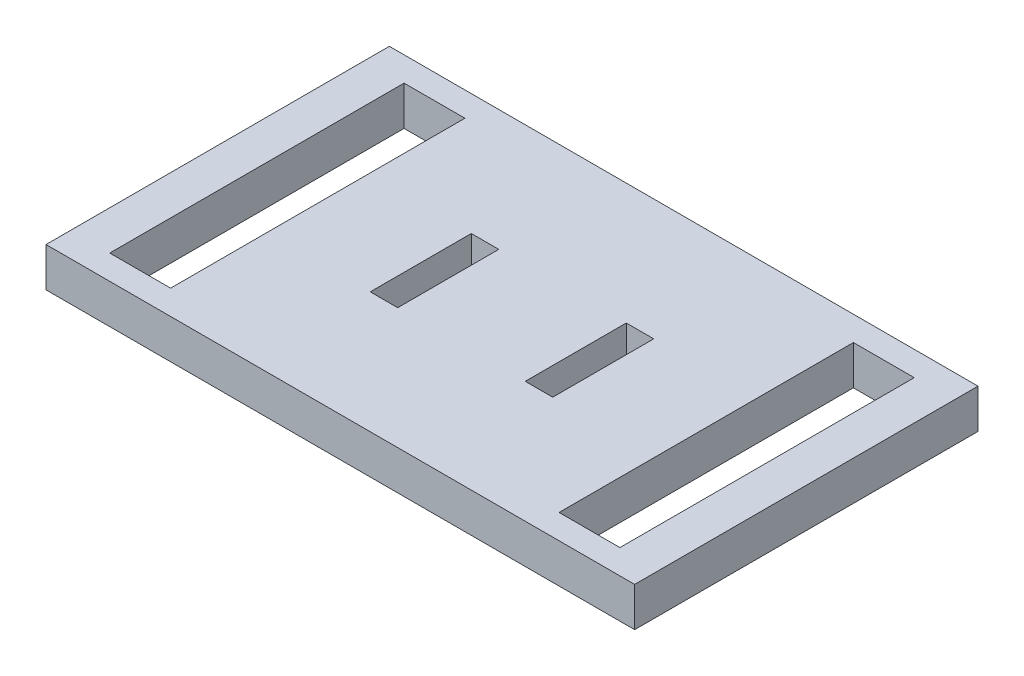
ISO-10303-21;
HEADER;
FILE_DESCRIPTION(('STEP AP214'),'2;1');
FILE_NAME('part.step','',(''),(''),'','','');
FILE_SCHEMA(('AUTOMOTIVE_DESIGN { 1 0 10303 214 1 1 1 1 }'));
ENDSEC;
DATA;
#1=APPLICATION_CONTEXT('core data for automotive mechanical design processes');
#2=APPLICATION_PROTOCOL_DEFINITION('international standard','automotive_design',2000,#1);
#3=PRODUCT_CONTEXT('',#1,'mechanical');
#4=PRODUCT('Part','Part','',(#3));
#5=PRODUCT_RELATED_PRODUCT_CATEGORY('part','',(#4));
#6=PRODUCT_DEFINITION_FORMATION('','',#4);
#7=PRODUCT_DEFINITION_CONTEXT('part definition',#1,'design');
#8=PRODUCT_DEFINITION('design','',#6,#7);
#9=PRODUCT_DEFINITION_SHAPE('','',#8);
#10=(LENGTH_UNIT() NAMED_UNIT(*) SI_UNIT(.MILLI.,.METRE.));
#11=(NAMED_UNIT(*) PLANE_ANGLE_UNIT() SI_UNIT($,.RADIAN.));
#12=(NAMED_UNIT(*) SI_UNIT($,.STERADIAN.) SOLID_ANGLE_UNIT());
#13=UNCERTAINTY_MEASURE_WITH_UNIT(LENGTH_MEASURE(1.E-05),#10,'distance_accuracy_value','');
#14=(GEOMETRIC_REPRESENTATION_CONTEXT(3) GLOBAL_UNCERTAINTY_ASSIGNED_CONTEXT((#13)) GLOBAL_UNIT_ASSIGNED_CONTEXT((#10,
#11,#12)) REPRESENTATION_CONTEXT('',''));
#15=CARTESIAN_POINT('',(0.,0.,0.));
#16=DIRECTION('',(0.,0.,1.));
#17=DIRECTION('',(1.,0.,0.));
#18=AXIS2_PLACEMENT_3D('',#15,#16,#17);
#19=CARTESIAN_POINT('',(0.,4.,0.));
#20=DIRECTION('',(0.,1.,0.));
#21=DIRECTION('',(0.,0.,1.));
#22=AXIS2_PLACEMENT_3D('',#19,#20,#21);
#23=PLANE('',#22);
#24=DIRECTION('',(0.,0.,1.));
#25=VECTOR('',#24,1.);
#26=CARTESIAN_POINT('',(-19.5406896540598,4.,-6.75221749933354));
#27=LINE('',#26,#25);
#28=CARTESIAN_POINT('',(-19.5406896540598,4.,-6.75221749933354));
#29=VERTEX_POINT('',#28);
#30=CARTESIAN_POINT('',(-19.5406896540598,4.,28.2477825006665));
#31=VERTEX_POINT('',#30);
#32=EDGE_CURVE('E298',#29,#31,#27,.T.);
#33=ORIENTED_EDGE('',*,*,#32,.T.);
#34=DIRECTION('',(1.,0.,0.));
#35=VECTOR('',#34,1.);
#36=CARTESIAN_POINT('',(-19.5406896540598,4.,28.2477825006665));
#37=LINE('',#36,#35);
#38=CARTESIAN_POINT('',(40.4593103459402,4.,28.2477825006665));
#39=VERTEX_POINT('',#38);
#40=EDGE_CURVE('E301',#31,#39,#37,.T.);
#41=ORIENTED_EDGE('',*,*,#40,.T.);
#42=DIRECTION('',(0.,0.,-1.));
#43=VECTOR('',#42,1.);
#44=CARTESIAN_POINT('',(40.4593103459402,4.,-6.75221749933354));
#45=LINE('',#44,#43);
#46=CARTESIAN_POINT('',(40.4593103459402,4.,-6.75221749933354));
#47=VERTEX_POINT('',#46);
#48=EDGE_CURVE('E304',#39,#47,#45,.T.);
#49=ORIENTED_EDGE('',*,*,#48,.T.);
#50=DIRECTION('',(-1.,0.,0.));
#51=VECTOR('',#50,1.);
#52=CARTESIAN_POINT('',(-19.5406896540598,4.,-6.75221749933354));
#53=LINE('',#52,#51);
#54=EDGE_CURVE('E306',#47,#29,#53,.T.);
#55=ORIENTED_EDGE('',*,*,#54,.T.);
#56=EDGE_LOOP('',(#33,#41,#49,#55));
#57=FACE_BOUND('',#56,.T.);
#58=DIRECTION('',(1.,0.,0.));
#59=VECTOR('',#58,1.);
#60=CARTESIAN_POINT('',(-15.5406896540597,4.,25.7477825006665));
#61=LINE('',#60,#59);
#62=CARTESIAN_POINT('',(-15.5406896540597,4.,25.7477825006665));
#63=VERTEX_POINT('',#62);
#64=CARTESIAN_POINT('',(-9.34068965405975,4.,25.7477825006665));
#65=VERTEX_POINT('',#64);
#66=EDGE_CURVE('E269',#63,#65,#61,.T.);
#67=ORIENTED_EDGE('',*,*,#66,.F.);
#68=DIRECTION('',(0.,0.,1.));
#69=VECTOR('',#68,1.);
#70=CARTESIAN_POINT('',(-15.5406896540598,4.,-4.25221749933353));
#71=LINE('',#70,#69);
#72=CARTESIAN_POINT('',(-15.5406896540598,4.,-4.25221749933353));
#73=VERTEX_POINT('',#72);
#74=EDGE_CURVE('E267',#73,#63,#71,.T.);
#75=ORIENTED_EDGE('',*,*,#74,.F.);
#76=DIRECTION('',(-1.,0.,0.));
#77=VECTOR('',#76,1.);
#78=CARTESIAN_POINT('',(-15.5406896540598,4.,-4.25221749933353));
#79=LINE('',#78,#77);
#80=CARTESIAN_POINT('',(-9.34068965405975,4.,-4.25221749933353));
#81=VERTEX_POINT('',#80);
#82=EDGE_CURVE('E275',#81,#73,#79,.T.);
#83=ORIENTED_EDGE('',*,*,#82,.F.);
#84=DIRECTION('',(0.,0.,-1.));
#85=VECTOR('',#84,1.);
#86=CARTESIAN_POINT('',(-9.34068965405975,4.,-4.25221749933353));
#87=LINE('',#86,#85);
#88=EDGE_CURVE('E272',#65,#81,#87,.T.);
#89=ORIENTED_EDGE('',*,*,#88,.F.);
#90=EDGE_LOOP('',(#67,#75,#83,#89));
#91=FACE_BOUND('',#90,.T.);
#92=DIRECTION('',(1.,0.,0.));
#93=VECTOR('',#92,1.);
#94=CARTESIAN_POINT('',(1.15931034594025,4.,15.8977825006665));
#95=LINE('',#94,#93);
#96=CARTESIAN_POINT('',(1.15931034594025,4.,15.8977825006665));
#97=VERTEX_POINT('',#96);
#98=CARTESIAN_POINT('',(3.95931034594025,4.,15.8977825006665));
#99=VERTEX_POINT('',#98);
#100=EDGE_CURVE('E238',#97,#99,#95,.T.);
#101=ORIENTED_EDGE('',*,*,#100,.F.);
#102=DIRECTION('',(0.,0.,1.));
#103=VECTOR('',#102,1.);
#104=CARTESIAN_POINT('',(1.15931034594025,4.,5.59778250066647));
#105=LINE('',#104,#103);
#106=CARTESIAN_POINT('',(1.15931034594025,4.,5.59778250066647));
#107=VERTEX_POINT('',#106);
#108=EDGE_CURVE('E236',#107,#97,#105,.T.);
#109=ORIENTED_EDGE('',*,*,#108,.F.);
#110=DIRECTION('',(-1.,0.,0.));
#111=VECTOR('',#110,1.);
#112=CARTESIAN_POINT('',(1.15931034594025,4.,5.59778250066647));
#113=LINE('',#112,#111);
#114=CARTESIAN_POINT('',(3.95931034594025,4.,5.59778250066647));
#115=VERTEX_POINT('',#114);
#116=EDGE_CURVE('E244',#115,#107,#113,.T.);
#117=ORIENTED_EDGE('',*,*,#116,.F.);
#118=DIRECTION('',(0.,0.,-1.));
#119=VECTOR('',#118,1.);
#120=CARTESIAN_POINT('',(3.95931034594025,4.,5.59778250066647));
#121=LINE('',#120,#119);
#122=EDGE_CURVE('E241',#99,#115,#121,.T.);
#123=ORIENTED_EDGE('',*,*,#122,.F.);
#124=EDGE_LOOP('',(#101,#109,#117,#123));
#125=FACE_BOUND('',#124,.T.);
#126=DIRECTION('',(-1.,0.,0.));
#127=VECTOR('',#126,1.);
#128=CARTESIAN_POINT('',(19.7593103459402,4.,5.59778250066647));
#129=LINE('',#128,#127);
#130=CARTESIAN_POINT('',(19.7593103459402,4.,5.59778250066647));
#131=VERTEX_POINT('',#130);
#132=CARTESIAN_POINT('',(16.9593103459402,4.,5.59778250066647));
#133=VERTEX_POINT('',#132);
#134=EDGE_CURVE('E207',#131,#133,#129,.T.);
#135=ORIENTED_EDGE('',*,*,#134,.F.);
#136=DIRECTION('',(0.,0.,-1.));
#137=VECTOR('',#136,1.);
#138=CARTESIAN_POINT('',(19.7593103459402,4.,5.59778250066647));
#139=LINE('',#138,#137);
#140=CARTESIAN_POINT('',(19.7593103459402,4.,15.8977825006665));
#141=VERTEX_POINT('',#140);
#142=EDGE_CURVE('E205',#141,#131,#139,.T.);
#143=ORIENTED_EDGE('',*,*,#142,.F.);
#144=DIRECTION('',(1.,0.,0.));
#145=VECTOR('',#144,1.);
#146=CARTESIAN_POINT('',(19.7593103459402,4.,15.8977825006665));
#147=LINE('',#146,#145);
#148=CARTESIAN_POINT('',(16.9593103459402,4.,15.8977825006665));
#149=VERTEX_POINT('',#148);
#150=EDGE_CURVE('E213',#149,#141,#147,.T.);
#151=ORIENTED_EDGE('',*,*,#150,.F.);
#152=DIRECTION('',(0.,0.,1.));
#153=VECTOR('',#152,1.);
#154=CARTESIAN_POINT('',(16.9593103459402,4.,5.59778250066647));
#155=LINE('',#154,#153);
#156=EDGE_CURVE('E210',#133,#149,#155,.T.);
#157=ORIENTED_EDGE('',*,*,#156,.F.);
#158=EDGE_LOOP('',(#135,#143,#151,#157));
#159=FACE_BOUND('',#158,.T.);
#160=DIRECTION('',(-1.,0.,0.));
#161=VECTOR('',#160,1.);
#162=CARTESIAN_POINT('',(36.4593103459403,4.,-4.25221749933353));
#163=LINE('',#162,#161);
#164=CARTESIAN_POINT('',(36.4593103459403,4.,-4.25221749933353));
#165=VERTEX_POINT('',#164);
#166=CARTESIAN_POINT('',(30.2593103459402,4.,-4.25221749933353));
#167=VERTEX_POINT('',#166);
#168=EDGE_CURVE('E177',#165,#167,#163,.T.);
#169=ORIENTED_EDGE('',*,*,#168,.F.);
#170=DIRECTION('',(0.,0.,-1.));
#171=VECTOR('',#170,1.);
#172=CARTESIAN_POINT('',(36.4593103459403,4.,-4.25221749933353));
#173=LINE('',#172,#171);
#174=CARTESIAN_POINT('',(36.4593103459402,4.,25.7477825006665));
#175=VERTEX_POINT('',#174);
#176=EDGE_CURVE('E169',#175,#165,#173,.T.);
#177=ORIENTED_EDGE('',*,*,#176,.F.);
#178=DIRECTION('',(1.,0.,0.));
#179=VECTOR('',#178,1.);
#180=CARTESIAN_POINT('',(36.4593103459402,4.,25.7477825006665));
#181=LINE('',#180,#179);
#182=CARTESIAN_POINT('',(30.2593103459402,4.,25.7477825006665));
#183=VERTEX_POINT('',#182);
#184=EDGE_CURVE('E191',#183,#175,#181,.T.);
#185=ORIENTED_EDGE('',*,*,#184,.F.);
#186=DIRECTION('',(0.,0.,1.));
#187=VECTOR('',#186,1.);
#188=CARTESIAN_POINT('',(30.2593103459402,4.,-4.25221749933353));
#189=LINE('',#188,#187);
#190=EDGE_CURVE('E189',#167,#183,#189,.T.);
#191=ORIENTED_EDGE('',*,*,#190,.F.);
#192=EDGE_LOOP('',(#169,#177,#185,#191));
#193=FACE_BOUND('',#192,.T.);
#194=ADVANCED_FACE('F32',(#57,#91,#125,#159,#193),#23,.T.);
#195=CARTESIAN_POINT('',(0.,0.,0.));
#196=DIRECTION('',(0.,1.,0.));
#197=DIRECTION('',(0.,0.,1.));
#198=AXIS2_PLACEMENT_3D('',#195,#196,#197);
#199=PLANE('',#198);
#200=DIRECTION('',(0.,0.,-1.));
#201=VECTOR('',#200,1.);
#202=CARTESIAN_POINT('',(19.7593103459402,0.,5.59778250066647));
#203=LINE('',#202,#201);
#204=CARTESIAN_POINT('',(19.7593103459402,0.,15.8977825006665));
#205=VERTEX_POINT('',#204);
#206=CARTESIAN_POINT('',(19.7593103459402,0.,5.59778250066647));
#207=VERTEX_POINT('',#206);
#208=EDGE_CURVE('E185',#205,#207,#203,.T.);
#209=ORIENTED_EDGE('',*,*,#208,.T.);
#210=DIRECTION('',(-1.,0.,0.));
#211=VECTOR('',#210,1.);
#212=CARTESIAN_POINT('',(19.7593103459402,0.,5.59778250066647));
#213=LINE('',#212,#211);
#214=CARTESIAN_POINT('',(16.9593103459402,0.,5.59778250066647));
#215=VERTEX_POINT('',#214);
#216=EDGE_CURVE('E218',#207,#215,#213,.T.);
#217=ORIENTED_EDGE('',*,*,#216,.T.);
#218=DIRECTION('',(0.,0.,1.));
#219=VECTOR('',#218,1.);
#220=CARTESIAN_POINT('',(16.9593103459402,0.,5.59778250066647));
#221=LINE('',#220,#219);
#222=CARTESIAN_POINT('',(16.9593103459402,0.,15.8977825006665));
#223=VERTEX_POINT('',#222);
#224=EDGE_CURVE('E221',#215,#223,#221,.T.);
#225=ORIENTED_EDGE('',*,*,#224,.T.);
#226=DIRECTION('',(1.,0.,0.));
#227=VECTOR('',#226,1.);
#228=CARTESIAN_POINT('',(19.7593103459402,0.,15.8977825006665));
#229=LINE('',#228,#227);
#230=EDGE_CURVE('E208',#223,#205,#229,.T.);
#231=ORIENTED_EDGE('',*,*,#230,.T.);
#232=EDGE_LOOP('',(#209,#217,#225,#231));
#233=FACE_BOUND('',#232,.T.);
#234=DIRECTION('',(0.,0.,1.));
#235=VECTOR('',#234,1.);
#236=CARTESIAN_POINT('',(-15.5406896540598,0.,-4.25221749933353));
#237=LINE('',#236,#235);
#238=CARTESIAN_POINT('',(-15.5406896540598,0.,-4.25221749933353));
#239=VERTEX_POINT('',#238);
#240=CARTESIAN_POINT('',(-15.5406896540597,0.,25.7477825006665));
#241=VERTEX_POINT('',#240);
#242=EDGE_CURVE('E266',#239,#241,#237,.T.);
#243=ORIENTED_EDGE('',*,*,#242,.T.);
#244=DIRECTION('',(1.,0.,0.));
#245=VECTOR('',#244,1.);
#246=CARTESIAN_POINT('',(-15.5406896540597,0.,25.7477825006665));
#247=LINE('',#246,#245);
#248=CARTESIAN_POINT('',(-9.34068965405975,0.,25.7477825006665));
#249=VERTEX_POINT('',#248);
#250=EDGE_CURVE('E280',#241,#249,#247,.T.);
#251=ORIENTED_EDGE('',*,*,#250,.T.);
#252=DIRECTION('',(0.,0.,-1.));
#253=VECTOR('',#252,1.);
#254=CARTESIAN_POINT('',(-9.34068965405975,0.,-4.25221749933353));
#255=LINE('',#254,#253);
#256=CARTESIAN_POINT('',(-9.34068965405975,0.,-4.25221749933353));
#257=VERTEX_POINT('',#256);
#258=EDGE_CURVE('E283',#249,#257,#255,.T.);
#259=ORIENTED_EDGE('',*,*,#258,.T.);
#260=DIRECTION('',(-1.,0.,0.));
#261=VECTOR('',#260,1.);
#262=CARTESIAN_POINT('',(-15.5406896540598,0.,-4.25221749933353));
#263=LINE('',#262,#261);
#264=EDGE_CURVE('E270',#257,#239,#263,.T.);
#265=ORIENTED_EDGE('',*,*,#264,.T.);
#266=EDGE_LOOP('',(#243,#251,#259,#265));
#267=FACE_BOUND('',#266,.T.);
#268=DIRECTION('',(0.,0.,1.));
#269=VECTOR('',#268,1.);
#270=CARTESIAN_POINT('',(-19.5406896540598,0.,-6.75221749933354));
#271=LINE('',#270,#269);
#272=CARTESIAN_POINT('',(-19.5406896540598,0.,-6.75221749933354));
#273=VERTEX_POINT('',#272);
#274=CARTESIAN_POINT('',(-19.5406896540598,0.,28.2477825006665));
#275=VERTEX_POINT('',#274);
#276=EDGE_CURVE('E297',#273,#275,#271,.T.);
#277=ORIENTED_EDGE('',*,*,#276,.F.);
#278=DIRECTION('',(-1.,0.,0.));
#279=VECTOR('',#278,1.);
#280=CARTESIAN_POINT('',(-19.5406896540598,0.,-6.75221749933354));
#281=LINE('',#280,#279);
#282=CARTESIAN_POINT('',(40.4593103459402,0.,-6.75221749933354));
#283=VERTEX_POINT('',#282);
#284=EDGE_CURVE('E302',#283,#273,#281,.T.);
#285=ORIENTED_EDGE('',*,*,#284,.F.);
#286=DIRECTION('',(0.,0.,-1.));
#287=VECTOR('',#286,1.);
#288=CARTESIAN_POINT('',(40.4593103459402,0.,-6.75221749933354));
#289=LINE('',#288,#287);
#290=CARTESIAN_POINT('',(40.4593103459402,0.,28.2477825006665));
#291=VERTEX_POINT('',#290);
#292=EDGE_CURVE('E313',#291,#283,#289,.T.);
#293=ORIENTED_EDGE('',*,*,#292,.F.);
#294=DIRECTION('',(1.,0.,0.));
#295=VECTOR('',#294,1.);
#296=CARTESIAN_POINT('',(-19.5406896540598,0.,28.2477825006665));
#297=LINE('',#296,#295);
#298=EDGE_CURVE('E311',#275,#291,#297,.T.);
#299=ORIENTED_EDGE('',*,*,#298,.F.);
#300=EDGE_LOOP('',(#277,#285,#293,#299));
#301=FACE_BOUND('',#300,.T.);
#302=DIRECTION('',(0.,0.,1.));
#303=VECTOR('',#302,1.);
#304=CARTESIAN_POINT('',(1.15931034594025,0.,5.59778250066647));
#305=LINE('',#304,#303);
#306=CARTESIAN_POINT('',(1.15931034594025,0.,5.59778250066647));
#307=VERTEX_POINT('',#306);
#308=CARTESIAN_POINT('',(1.15931034594025,0.,15.8977825006665));
#309=VERTEX_POINT('',#308);
#310=EDGE_CURVE('E235',#307,#309,#305,.T.);
#311=ORIENTED_EDGE('',*,*,#310,.T.);
#312=DIRECTION('',(1.,0.,0.));
#313=VECTOR('',#312,1.);
#314=CARTESIAN_POINT('',(1.15931034594025,0.,15.8977825006665));
#315=LINE('',#314,#313);
#316=CARTESIAN_POINT('',(3.95931034594025,0.,15.8977825006665));
#317=VERTEX_POINT('',#316);
#318=EDGE_CURVE('E249',#309,#317,#315,.T.);
#319=ORIENTED_EDGE('',*,*,#318,.T.);
#320=DIRECTION('',(0.,0.,-1.));
#321=VECTOR('',#320,1.);
#322=CARTESIAN_POINT('',(3.95931034594025,0.,5.59778250066647));
#323=LINE('',#322,#321);
#324=CARTESIAN_POINT('',(3.95931034594025,0.,5.59778250066647));
#325=VERTEX_POINT('',#324);
#326=EDGE_CURVE('E252',#317,#325,#323,.T.);
#327=ORIENTED_EDGE('',*,*,#326,.T.);
#328=DIRECTION('',(-1.,0.,0.));
#329=VECTOR('',#328,1.);
#330=CARTESIAN_POINT('',(1.15931034594025,0.,5.59778250066647));
#331=LINE('',#330,#329);
#332=EDGE_CURVE('E239',#325,#307,#331,.T.);
#333=ORIENTED_EDGE('',*,*,#332,.T.);
#334=EDGE_LOOP('',(#311,#319,#327,#333));
#335=FACE_BOUND('',#334,.T.);
#336=DIRECTION('',(0.,0.,-1.));
#337=VECTOR('',#336,1.);
#338=CARTESIAN_POINT('',(36.4593103459403,0.,-4.25221749933353));
#339=LINE('',#338,#337);
#340=CARTESIAN_POINT('',(36.4593103459402,0.,25.7477825006665));
#341=VERTEX_POINT('',#340);
#342=CARTESIAN_POINT('',(36.4593103459403,0.,-4.25221749933353));
#343=VERTEX_POINT('',#342);
#344=EDGE_CURVE('E55',#341,#343,#339,.T.);
#345=ORIENTED_EDGE('',*,*,#344,.T.);
#346=DIRECTION('',(-1.,0.,0.));
#347=VECTOR('',#346,1.);
#348=CARTESIAN_POINT('',(36.4593103459403,0.,-4.25221749933353));
#349=LINE('',#348,#347);
#350=CARTESIAN_POINT('',(30.2593103459402,0.,-4.25221749933353));
#351=VERTEX_POINT('',#350);
#352=EDGE_CURVE('E184',#343,#351,#349,.T.);
#353=ORIENTED_EDGE('',*,*,#352,.T.);
#354=DIRECTION('',(0.,0.,1.));
#355=VECTOR('',#354,1.);
#356=CARTESIAN_POINT('',(30.2593103459402,0.,-4.25221749933353));
#357=LINE('',#356,#355);
#358=CARTESIAN_POINT('',(30.2593103459402,0.,25.7477825006665));
#359=VERTEX_POINT('',#358);
#360=EDGE_CURVE('E197',#351,#359,#357,.T.);
#361=ORIENTED_EDGE('',*,*,#360,.T.);
#362=DIRECTION('',(1.,0.,0.));
#363=VECTOR('',#362,1.);
#364=CARTESIAN_POINT('',(36.4593103459402,0.,25.7477825006665));
#365=LINE('',#364,#363);
#366=EDGE_CURVE('E178',#359,#341,#365,.T.);
#367=ORIENTED_EDGE('',*,*,#366,.T.);
#368=EDGE_LOOP('',(#345,#353,#361,#367));
#369=FACE_BOUND('',#368,.T.);
#370=ADVANCED_FACE('F331',(#233,#267,#301,#335,#369),#199,.F.);
#371=CARTESIAN_POINT('',(-19.5406896540598,4.,-6.75221749933354));
#372=DIRECTION('',(1.,0.,0.));
#373=DIRECTION('',(0.,0.,-1.));
#374=AXIS2_PLACEMENT_3D('',#371,#372,#373);
#375=PLANE('',#374);
#376=ORIENTED_EDGE('',*,*,#276,.T.);
#377=DIRECTION('',(0.,-1.,0.));
#378=VECTOR('',#377,1.);
#379=CARTESIAN_POINT('',(-19.5406896540598,4.,28.2477825006665));
#380=LINE('',#379,#378);
#381=EDGE_CURVE('E11',#31,#275,#380,.T.);
#382=ORIENTED_EDGE('',*,*,#381,.F.);
#383=ORIENTED_EDGE('',*,*,#32,.F.);
#384=DIRECTION('',(0.,-1.,0.));
#385=VECTOR('',#384,1.);
#386=CARTESIAN_POINT('',(-19.5406896540598,4.,-6.75221749933354));
#387=LINE('',#386,#385);
#388=EDGE_CURVE('E308',#29,#273,#387,.T.);
#389=ORIENTED_EDGE('',*,*,#388,.T.);
#390=EDGE_LOOP('',(#376,#382,#383,#389));
#391=FACE_BOUND('',#390,.T.);
#392=ADVANCED_FACE('F34',(#391),#375,.F.);
#393=CARTESIAN_POINT('',(-19.5406896540598,4.,28.2477825006665));
#394=DIRECTION('',(0.,0.,-1.));
#395=DIRECTION('',(-1.,0.,0.));
#396=AXIS2_PLACEMENT_3D('',#393,#394,#395);
#397=PLANE('',#396);
#398=ORIENTED_EDGE('',*,*,#298,.T.);
#399=DIRECTION('',(0.,-1.,0.));
#400=VECTOR('',#399,1.);
#401=CARTESIAN_POINT('',(40.4593103459402,4.,28.2477825006665));
#402=LINE('',#401,#400);
#403=EDGE_CURVE('E40',#39,#291,#402,.T.);
#404=ORIENTED_EDGE('',*,*,#403,.F.);
#405=ORIENTED_EDGE('',*,*,#40,.F.);
#406=ORIENTED_EDGE('',*,*,#381,.T.);
#407=EDGE_LOOP('',(#398,#404,#405,#406));
#408=FACE_BOUND('',#407,.T.);
#409=ADVANCED_FACE('F342',(#408),#397,.F.);
#410=CARTESIAN_POINT('',(40.4593103459402,4.,-6.75221749933354));
#411=DIRECTION('',(-1.,0.,0.));
#412=DIRECTION('',(0.,0.,1.));
#413=AXIS2_PLACEMENT_3D('',#410,#411,#412);
#414=PLANE('',#413);
#415=ORIENTED_EDGE('',*,*,#292,.T.);
#416=DIRECTION('',(0.,-1.,0.));
#417=VECTOR('',#416,1.);
#418=CARTESIAN_POINT('',(40.4593103459402,4.,-6.75221749933354));
#419=LINE('',#418,#417);
#420=EDGE_CURVE('E318',#47,#283,#419,.T.);
#421=ORIENTED_EDGE('',*,*,#420,.F.);
#422=ORIENTED_EDGE('',*,*,#48,.F.);
#423=ORIENTED_EDGE('',*,*,#403,.T.);
#424=EDGE_LOOP('',(#415,#421,#422,#423));
#425=FACE_BOUND('',#424,.T.);
#426=ADVANCED_FACE('F325',(#425),#414,.F.);
#427=CARTESIAN_POINT('',(-19.5406896540598,4.,-6.75221749933354));
#428=DIRECTION('',(0.,0.,1.));
#429=DIRECTION('',(1.,0.,0.));
#430=AXIS2_PLACEMENT_3D('',#427,#428,#429);
#431=PLANE('',#430);
#432=ORIENTED_EDGE('',*,*,#284,.T.);
#433=ORIENTED_EDGE('',*,*,#388,.F.);
#434=ORIENTED_EDGE('',*,*,#54,.F.);
#435=ORIENTED_EDGE('',*,*,#420,.T.);
#436=EDGE_LOOP('',(#432,#433,#434,#435));
#437=FACE_BOUND('',#436,.T.);
#438=ADVANCED_FACE('F335',(#437),#431,.F.);
#439=CARTESIAN_POINT('',(-15.5406896540598,4.,-4.25221749933353));
#440=DIRECTION('',(1.,0.,0.));
#441=DIRECTION('',(0.,0.,-1.));
#442=AXIS2_PLACEMENT_3D('',#439,#440,#441);
#443=PLANE('',#442);
#444=ORIENTED_EDGE('',*,*,#242,.F.);
#445=DIRECTION('',(0.,-1.,0.));
#446=VECTOR('',#445,1.);
#447=CARTESIAN_POINT('',(-15.5406896540598,4.,-4.25221749933353));
#448=LINE('',#447,#446);
#449=EDGE_CURVE('E277',#73,#239,#448,.T.);
#450=ORIENTED_EDGE('',*,*,#449,.F.);
#451=ORIENTED_EDGE('',*,*,#74,.T.);
#452=DIRECTION('',(0.,-1.,0.));
#453=VECTOR('',#452,1.);
#454=CARTESIAN_POINT('',(-15.5406896540597,4.,25.7477825006665));
#455=LINE('',#454,#453);
#456=EDGE_CURVE('E294',#63,#241,#455,.T.);
#457=ORIENTED_EDGE('',*,*,#456,.T.);
#458=EDGE_LOOP('',(#444,#450,#451,#457));
#459=FACE_BOUND('',#458,.T.);
#460=ADVANCED_FACE('F357',(#459),#443,.T.);
#461=CARTESIAN_POINT('',(-15.5406896540597,4.,25.7477825006665));
#462=DIRECTION('',(0.,0.,-1.));
#463=DIRECTION('',(-1.,0.,0.));
#464=AXIS2_PLACEMENT_3D('',#461,#462,#463);
#465=PLANE('',#464);
#466=ORIENTED_EDGE('',*,*,#250,.F.);
#467=ORIENTED_EDGE('',*,*,#456,.F.);
#468=ORIENTED_EDGE('',*,*,#66,.T.);
#469=DIRECTION('',(0.,-1.,0.));
#470=VECTOR('',#469,1.);
#471=CARTESIAN_POINT('',(-9.34068965405975,4.,25.7477825006665));
#472=LINE('',#471,#470);
#473=EDGE_CURVE('E292',#65,#249,#472,.T.);
#474=ORIENTED_EDGE('',*,*,#473,.T.);
#475=EDGE_LOOP('',(#466,#467,#468,#474));
#476=FACE_BOUND('',#475,.T.);
#477=ADVANCED_FACE('F364',(#476),#465,.T.);
#478=CARTESIAN_POINT('',(-9.34068965405975,4.,-4.25221749933353));
#479=DIRECTION('',(-1.,0.,0.));
#480=DIRECTION('',(0.,0.,1.));
#481=AXIS2_PLACEMENT_3D('',#478,#479,#480);
#482=PLANE('',#481);
#483=ORIENTED_EDGE('',*,*,#258,.F.);
#484=ORIENTED_EDGE('',*,*,#473,.F.);
#485=ORIENTED_EDGE('',*,*,#88,.T.);
#486=DIRECTION('',(0.,-1.,0.));
#487=VECTOR('',#486,1.);
#488=CARTESIAN_POINT('',(-9.34068965405975,4.,-4.25221749933353));
#489=LINE('',#488,#487);
#490=EDGE_CURVE('E290',#81,#257,#489,.T.);
#491=ORIENTED_EDGE('',*,*,#490,.T.);
#492=EDGE_LOOP('',(#483,#484,#485,#491));
#493=FACE_BOUND('',#492,.T.);
#494=ADVANCED_FACE('F369',(#493),#482,.T.);
#495=CARTESIAN_POINT('',(-15.5406896540598,4.,-4.25221749933353));
#496=DIRECTION('',(0.,0.,1.));
#497=DIRECTION('',(1.,0.,0.));
#498=AXIS2_PLACEMENT_3D('',#495,#496,#497);
#499=PLANE('',#498);
#500=ORIENTED_EDGE('',*,*,#264,.F.);
#501=ORIENTED_EDGE('',*,*,#490,.F.);
#502=ORIENTED_EDGE('',*,*,#82,.T.);
#503=ORIENTED_EDGE('',*,*,#449,.T.);
#504=EDGE_LOOP('',(#500,#501,#502,#503));
#505=FACE_BOUND('',#504,.T.);
#506=ADVANCED_FACE('F377',(#505),#499,.T.);
#507=CARTESIAN_POINT('',(1.15931034594025,4.,5.59778250066647));
#508=DIRECTION('',(1.,0.,0.));
#509=DIRECTION('',(0.,0.,-1.));
#510=AXIS2_PLACEMENT_3D('',#507,#508,#509);
#511=PLANE('',#510);
#512=ORIENTED_EDGE('',*,*,#310,.F.);
#513=DIRECTION('',(0.,-1.,0.));
#514=VECTOR('',#513,1.);
#515=CARTESIAN_POINT('',(1.15931034594025,4.,5.59778250066647));
#516=LINE('',#515,#514);
#517=EDGE_CURVE('E246',#107,#307,#516,.T.);
#518=ORIENTED_EDGE('',*,*,#517,.F.);
#519=ORIENTED_EDGE('',*,*,#108,.T.);
#520=DIRECTION('',(0.,-1.,0.));
#521=VECTOR('',#520,1.);
#522=CARTESIAN_POINT('',(1.15931034594025,4.,15.8977825006665));
#523=LINE('',#522,#521);
#524=EDGE_CURVE('E263',#97,#309,#523,.T.);
#525=ORIENTED_EDGE('',*,*,#524,.T.);
#526=EDGE_LOOP('',(#512,#518,#519,#525));
#527=FACE_BOUND('',#526,.T.);
#528=ADVANCED_FACE('F431',(#527),#511,.T.);
#529=CARTESIAN_POINT('',(1.15931034594025,4.,15.8977825006665));
#530=DIRECTION('',(0.,0.,-1.));
#531=DIRECTION('',(-1.,0.,0.));
#532=AXIS2_PLACEMENT_3D('',#529,#530,#531);
#533=PLANE('',#532);
#534=ORIENTED_EDGE('',*,*,#318,.F.);
#535=ORIENTED_EDGE('',*,*,#524,.F.);
#536=ORIENTED_EDGE('',*,*,#100,.T.);
#537=DIRECTION('',(0.,-1.,0.));
#538=VECTOR('',#537,1.);
#539=CARTESIAN_POINT('',(3.95931034594025,4.,15.8977825006665));
#540=LINE('',#539,#538);
#541=EDGE_CURVE('E261',#99,#317,#540,.T.);
#542=ORIENTED_EDGE('',*,*,#541,.T.);
#543=EDGE_LOOP('',(#534,#535,#536,#542));
#544=FACE_BOUND('',#543,.T.);
#545=ADVANCED_FACE('F427',(#544),#533,.T.);
#546=CARTESIAN_POINT('',(3.95931034594025,4.,5.59778250066647));
#547=DIRECTION('',(-1.,0.,0.));
#548=DIRECTION('',(0.,0.,1.));
#549=AXIS2_PLACEMENT_3D('',#546,#547,#548);
#550=PLANE('',#549);
#551=ORIENTED_EDGE('',*,*,#326,.F.);
#552=ORIENTED_EDGE('',*,*,#541,.F.);
#553=ORIENTED_EDGE('',*,*,#122,.T.);
#554=DIRECTION('',(0.,-1.,0.));
#555=VECTOR('',#554,1.);
#556=CARTESIAN_POINT('',(3.95931034594025,4.,5.59778250066647));
#557=LINE('',#556,#555);
#558=EDGE_CURVE('E259',#115,#325,#557,.T.);
#559=ORIENTED_EDGE('',*,*,#558,.T.);
#560=EDGE_LOOP('',(#551,#552,#553,#559));
#561=FACE_BOUND('',#560,.T.);
#562=ADVANCED_FACE('F423',(#561),#550,.T.);
#563=CARTESIAN_POINT('',(1.15931034594025,4.,5.59778250066647));
#564=DIRECTION('',(0.,0.,1.));
#565=DIRECTION('',(1.,0.,0.));
#566=AXIS2_PLACEMENT_3D('',#563,#564,#565);
#567=PLANE('',#566);
#568=ORIENTED_EDGE('',*,*,#332,.F.);
#569=ORIENTED_EDGE('',*,*,#558,.F.);
#570=ORIENTED_EDGE('',*,*,#116,.T.);
#571=ORIENTED_EDGE('',*,*,#517,.T.);
#572=EDGE_LOOP('',(#568,#569,#570,#571));
#573=FACE_BOUND('',#572,.T.);
#574=ADVANCED_FACE('F420',(#573),#567,.T.);
#575=CARTESIAN_POINT('',(19.7593103459402,4.,5.59778250066647));
#576=DIRECTION('',(-1.,0.,0.));
#577=DIRECTION('',(0.,0.,1.));
#578=AXIS2_PLACEMENT_3D('',#575,#576,#577);
#579=PLANE('',#578);
#580=ORIENTED_EDGE('',*,*,#208,.F.);
#581=DIRECTION('',(0.,-1.,0.));
#582=VECTOR('',#581,1.);
#583=CARTESIAN_POINT('',(19.7593103459402,4.,15.8977825006665));
#584=LINE('',#583,#582);
#585=EDGE_CURVE('E215',#141,#205,#584,.T.);
#586=ORIENTED_EDGE('',*,*,#585,.F.);
#587=ORIENTED_EDGE('',*,*,#142,.T.);
#588=DIRECTION('',(0.,-1.,0.));
#589=VECTOR('',#588,1.);
#590=CARTESIAN_POINT('',(19.7593103459402,4.,5.59778250066647));
#591=LINE('',#590,#589);
#592=EDGE_CURVE('E232',#131,#207,#591,.T.);
#593=ORIENTED_EDGE('',*,*,#592,.T.);
#594=EDGE_LOOP('',(#580,#586,#587,#593));
#595=FACE_BOUND('',#594,.T.);
#596=ADVANCED_FACE('F402',(#595),#579,.T.);
#597=CARTESIAN_POINT('',(19.7593103459402,4.,5.59778250066647));
#598=DIRECTION('',(0.,0.,1.));
#599=DIRECTION('',(1.,0.,0.));
#600=AXIS2_PLACEMENT_3D('',#597,#598,#599);
#601=PLANE('',#600);
#602=ORIENTED_EDGE('',*,*,#216,.F.);
#603=ORIENTED_EDGE('',*,*,#592,.F.);
#604=ORIENTED_EDGE('',*,*,#134,.T.);
#605=DIRECTION('',(0.,-1.,0.));
#606=VECTOR('',#605,1.);
#607=CARTESIAN_POINT('',(16.9593103459402,4.,5.59778250066647));
#608=LINE('',#607,#606);
#609=EDGE_CURVE('E230',#133,#215,#608,.T.);
#610=ORIENTED_EDGE('',*,*,#609,.T.);
#611=EDGE_LOOP('',(#602,#603,#604,#610));
#612=FACE_BOUND('',#611,.T.);
#613=ADVANCED_FACE('F396',(#612),#601,.T.);
#614=CARTESIAN_POINT('',(16.9593103459402,4.,5.59778250066647));
#615=DIRECTION('',(1.,0.,0.));
#616=DIRECTION('',(0.,0.,-1.));
#617=AXIS2_PLACEMENT_3D('',#614,#615,#616);
#618=PLANE('',#617);
#619=ORIENTED_EDGE('',*,*,#224,.F.);
#620=ORIENTED_EDGE('',*,*,#609,.F.);
#621=ORIENTED_EDGE('',*,*,#156,.T.);
#622=DIRECTION('',(0.,-1.,0.));
#623=VECTOR('',#622,1.);
#624=CARTESIAN_POINT('',(16.9593103459402,4.,15.8977825006665));
#625=LINE('',#624,#623);
#626=EDGE_CURVE('E228',#149,#223,#625,.T.);
#627=ORIENTED_EDGE('',*,*,#626,.T.);
#628=EDGE_LOOP('',(#619,#620,#621,#627));
#629=FACE_BOUND('',#628,.T.);
#630=ADVANCED_FACE('F399',(#629),#618,.T.);
#631=CARTESIAN_POINT('',(19.7593103459402,4.,15.8977825006665));
#632=DIRECTION('',(0.,0.,-1.));
#633=DIRECTION('',(-1.,0.,0.));
#634=AXIS2_PLACEMENT_3D('',#631,#632,#633);
#635=PLANE('',#634);
#636=ORIENTED_EDGE('',*,*,#230,.F.);
#637=ORIENTED_EDGE('',*,*,#626,.F.);
#638=ORIENTED_EDGE('',*,*,#150,.T.);
#639=ORIENTED_EDGE('',*,*,#585,.T.);
#640=EDGE_LOOP('',(#636,#637,#638,#639));
#641=FACE_BOUND('',#640,.T.);
#642=ADVANCED_FACE('F405',(#641),#635,.T.);
#643=CARTESIAN_POINT('',(36.4593103459403,4.,-4.25221749933353));
#644=DIRECTION('',(-1.,0.,0.));
#645=DIRECTION('',(0.,0.,1.));
#646=AXIS2_PLACEMENT_3D('',#643,#644,#645);
#647=PLANE('',#646);
#648=ORIENTED_EDGE('',*,*,#344,.F.);
#649=DIRECTION('',(0.,-1.,0.));
#650=VECTOR('',#649,1.);
#651=CARTESIAN_POINT('',(36.4593103459402,4.,25.7477825006665));
#652=LINE('',#651,#650);
#653=EDGE_CURVE('E173',#175,#341,#652,.T.);
#654=ORIENTED_EDGE('',*,*,#653,.F.);
#655=ORIENTED_EDGE('',*,*,#176,.T.);
#656=DIRECTION('',(0.,-1.,0.));
#657=VECTOR('',#656,1.);
#658=CARTESIAN_POINT('',(36.4593103459403,4.,-4.25221749933353));
#659=LINE('',#658,#657);
#660=EDGE_CURVE('E172',#165,#343,#659,.T.);
#661=ORIENTED_EDGE('',*,*,#660,.T.);
#662=EDGE_LOOP('',(#648,#654,#655,#661));
#663=FACE_BOUND('',#662,.T.);
#664=ADVANCED_FACE('F171',(#663),#647,.T.);
#665=CARTESIAN_POINT('',(36.4593103459403,4.,-4.25221749933353));
#666=DIRECTION('',(0.,0.,1.));
#667=DIRECTION('',(1.,0.,0.));
#668=AXIS2_PLACEMENT_3D('',#665,#666,#667);
#669=PLANE('',#668);
#670=ORIENTED_EDGE('',*,*,#352,.F.);
#671=ORIENTED_EDGE('',*,*,#660,.F.);
#672=ORIENTED_EDGE('',*,*,#168,.T.);
#673=DIRECTION('',(0.,-1.,0.));
#674=VECTOR('',#673,1.);
#675=CARTESIAN_POINT('',(30.2593103459402,4.,-4.25221749933353));
#676=LINE('',#675,#674);
#677=EDGE_CURVE('E186',#167,#351,#676,.T.);
#678=ORIENTED_EDGE('',*,*,#677,.T.);
#679=EDGE_LOOP('',(#670,#671,#672,#678));
#680=FACE_BOUND('',#679,.T.);
#681=ADVANCED_FACE('F181',(#680),#669,.T.);
#682=CARTESIAN_POINT('',(30.2593103459402,4.,-4.25221749933353));
#683=DIRECTION('',(1.,0.,0.));
#684=DIRECTION('',(0.,0.,-1.));
#685=AXIS2_PLACEMENT_3D('',#682,#683,#684);
#686=PLANE('',#685);
#687=ORIENTED_EDGE('',*,*,#360,.F.);
#688=ORIENTED_EDGE('',*,*,#677,.F.);
#689=ORIENTED_EDGE('',*,*,#190,.T.);
#690=DIRECTION('',(0.,-1.,0.));
#691=VECTOR('',#690,1.);
#692=CARTESIAN_POINT('',(30.2593103459402,4.,25.7477825006665));
#693=LINE('',#692,#691);
#694=EDGE_CURVE('E47',#183,#359,#693,.T.);
#695=ORIENTED_EDGE('',*,*,#694,.T.);
#696=EDGE_LOOP('',(#687,#688,#689,#695));
#697=FACE_BOUND('',#696,.T.);
#698=ADVANCED_FACE('F494',(#697),#686,.T.);
#699=CARTESIAN_POINT('',(36.4593103459402,4.,25.7477825006665));
#700=DIRECTION('',(0.,0.,-1.));
#701=DIRECTION('',(-1.,0.,0.));
#702=AXIS2_PLACEMENT_3D('',#699,#700,#701);
#703=PLANE('',#702);
#704=ORIENTED_EDGE('',*,*,#366,.F.);
#705=ORIENTED_EDGE('',*,*,#694,.F.);
#706=ORIENTED_EDGE('',*,*,#184,.T.);
#707=ORIENTED_EDGE('',*,*,#653,.T.);
#708=EDGE_LOOP('',(#704,#705,#706,#707));
#709=FACE_BOUND('',#708,.T.);
#710=ADVANCED_FACE('F502',(#709),#703,.T.);
#711=CLOSED_SHELL('',(#194,#370,#392,#409,#426,#438,#460,#477,#494,#506,#528,#545,#562,#574,
#596,#613,#630,#642,#664,#681,#698,#710));
#712=MANIFOLD_SOLID_BREP('B2',#711);
#713=ADVANCED_BREP_SHAPE_REPRESENTATION('',(#18,#712),#14);
#714=SHAPE_DEFINITION_REPRESENTATION(#9,#713);
ENDSEC;
END-ISO-10303-21;
